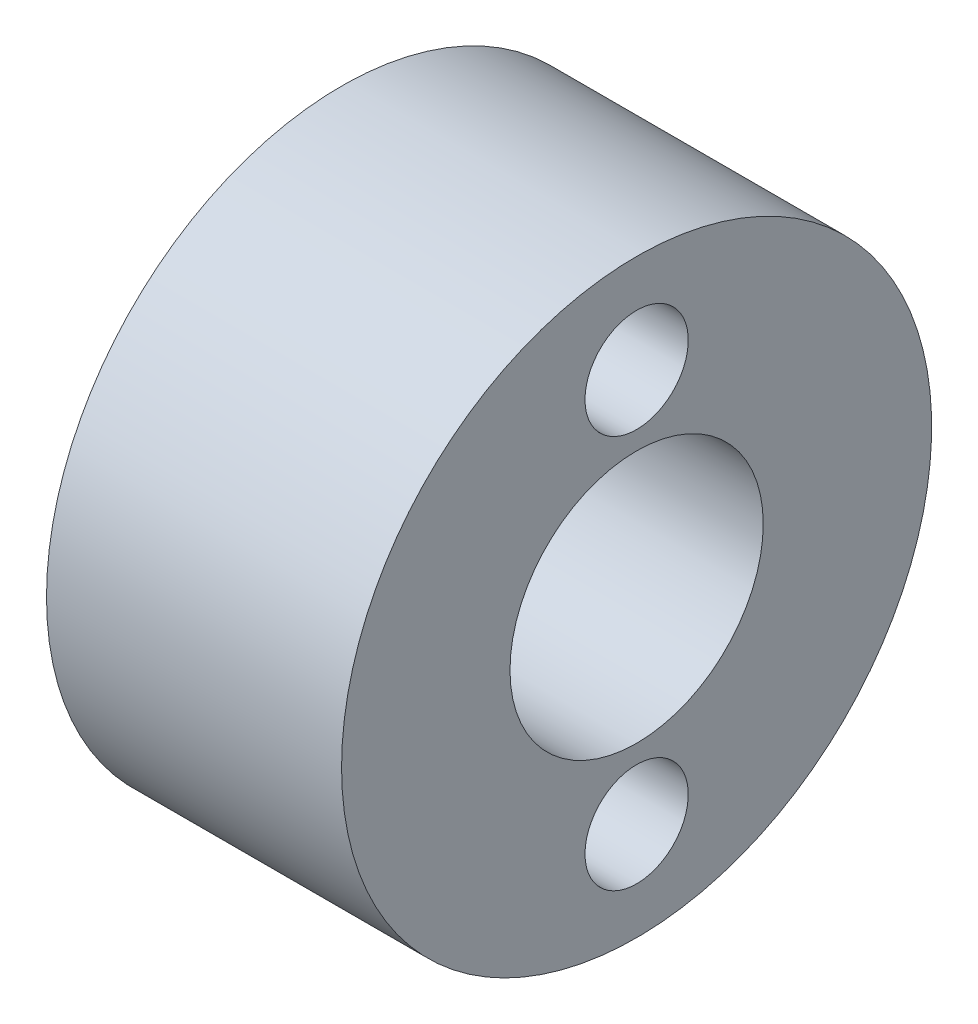
ISO-10303-21;
HEADER;
FILE_DESCRIPTION(('STEP AP214'),'2;1');
FILE_NAME('part.step','',(''),(''),'','','');
FILE_SCHEMA(('AUTOMOTIVE_DESIGN { 1 0 10303 214 1 1 1 1 }'));
ENDSEC;
DATA;
#1=APPLICATION_CONTEXT('core data for automotive mechanical design processes');
#2=APPLICATION_PROTOCOL_DEFINITION('international standard','automotive_design',2000,#1);
#3=PRODUCT_CONTEXT('',#1,'mechanical');
#4=PRODUCT('Part','Part','',(#3));
#5=PRODUCT_RELATED_PRODUCT_CATEGORY('part','',(#4));
#6=PRODUCT_DEFINITION_FORMATION('','',#4);
#7=PRODUCT_DEFINITION_CONTEXT('part definition',#1,'design');
#8=PRODUCT_DEFINITION('design','',#6,#7);
#9=PRODUCT_DEFINITION_SHAPE('','',#8);
#10=(LENGTH_UNIT() NAMED_UNIT(*) SI_UNIT(.MILLI.,.METRE.));
#11=(NAMED_UNIT(*) PLANE_ANGLE_UNIT() SI_UNIT($,.RADIAN.));
#12=(NAMED_UNIT(*) SI_UNIT($,.STERADIAN.) SOLID_ANGLE_UNIT());
#13=UNCERTAINTY_MEASURE_WITH_UNIT(LENGTH_MEASURE(1.E-05),#10,'distance_accuracy_value','');
#14=(GEOMETRIC_REPRESENTATION_CONTEXT(3) GLOBAL_UNCERTAINTY_ASSIGNED_CONTEXT((#13)) GLOBAL_UNIT_ASSIGNED_CONTEXT((#10,
#11,#12)) REPRESENTATION_CONTEXT('',''));
#15=CARTESIAN_POINT('',(0.,0.,0.));
#16=DIRECTION('',(0.,0.,1.));
#17=DIRECTION('',(1.,0.,0.));
#18=AXIS2_PLACEMENT_3D('',#15,#16,#17);
#19=CARTESIAN_POINT('',(25.,8.,-44.));
#20=DIRECTION('',(1.,0.,0.));
#21=DIRECTION('',(0.,0.,-1.));
#22=AXIS2_PLACEMENT_3D('',#19,#20,#21);
#23=PLANE('',#22);
#24=CARTESIAN_POINT('',(25.,8.,-44.));
#25=DIRECTION('',(-1.,0.,0.));
#26=DIRECTION('',(0.,0.,1.));
#27=AXIS2_PLACEMENT_3D('',#24,#25,#26);
#28=CIRCLE('',#27,2.1);
#29=CARTESIAN_POINT('',(25.,8.,-41.9));
#30=VERTEX_POINT('',#29);
#31=EDGE_CURVE('E16',#30,#30,#28,.F.);
#32=ORIENTED_EDGE('',*,*,#31,.T.);
#33=EDGE_LOOP('',(#32));
#34=FACE_BOUND('',#33,.T.);
#35=ADVANCED_FACE('F13',(#34),#23,.T.);
#36=CARTESIAN_POINT('',(25.,-8.,-44.));
#37=DIRECTION('',(1.,0.,0.));
#38=DIRECTION('',(0.,0.,-1.));
#39=AXIS2_PLACEMENT_3D('',#36,#37,#38);
#40=PLANE('',#39);
#41=CARTESIAN_POINT('',(25.,-8.,-44.));
#42=DIRECTION('',(-1.,0.,0.));
#43=DIRECTION('',(0.,0.,1.));
#44=AXIS2_PLACEMENT_3D('',#41,#42,#43);
#45=CIRCLE('',#44,2.1);
#46=CARTESIAN_POINT('',(25.,-8.,-41.9));
#47=VERTEX_POINT('',#46);
#48=EDGE_CURVE('E38',#47,#47,#45,.F.);
#49=ORIENTED_EDGE('',*,*,#48,.T.);
#50=EDGE_LOOP('',(#49));
#51=FACE_BOUND('',#50,.T.);
#52=ADVANCED_FACE('F49',(#51),#40,.T.);
#53=CARTESIAN_POINT('',(25.,8.,-44.));
#54=DIRECTION('',(-1.,0.,0.));
#55=DIRECTION('',(0.,0.,1.));
#56=AXIS2_PLACEMENT_3D('',#53,#54,#55);
#57=CYLINDRICAL_SURFACE('',#56,2.1);
#58=CARTESIAN_POINT('',(31.,8.,-44.));
#59=DIRECTION('',(-1.,0.,0.));
#60=DIRECTION('',(0.,0.,1.));
#61=AXIS2_PLACEMENT_3D('',#58,#59,#60);
#62=CIRCLE('',#61,2.1);
#63=CARTESIAN_POINT('',(31.,8.,-41.9));
#64=VERTEX_POINT('',#63);
#65=EDGE_CURVE('E33',#64,#64,#62,.T.);
#66=ORIENTED_EDGE('',*,*,#65,.F.);
#67=EDGE_LOOP('',(#66));
#68=FACE_BOUND('',#67,.T.);
#69=ORIENTED_EDGE('',*,*,#31,.F.);
#70=EDGE_LOOP('',(#69));
#71=FACE_BOUND('',#70,.T.);
#72=ADVANCED_FACE('F46',(#68,#71),#57,.F.);
#73=CARTESIAN_POINT('',(18.,0.,-44.));
#74=DIRECTION('',(-1.,0.,0.));
#75=DIRECTION('',(0.,0.,1.));
#76=AXIS2_PLACEMENT_3D('',#73,#74,#75);
#77=CYLINDRICAL_SURFACE('',#76,5.15);
#78=CARTESIAN_POINT('',(31.,0.,-44.));
#79=DIRECTION('',(-1.,0.,0.));
#80=DIRECTION('',(0.,0.,1.));
#81=AXIS2_PLACEMENT_3D('',#78,#79,#80);
#82=CIRCLE('',#81,5.15);
#83=CARTESIAN_POINT('',(31.,0.,-38.85));
#84=VERTEX_POINT('',#83);
#85=EDGE_CURVE('E30',#84,#84,#82,.T.);
#86=ORIENTED_EDGE('',*,*,#85,.F.);
#87=EDGE_LOOP('',(#86));
#88=FACE_BOUND('',#87,.T.);
#89=CARTESIAN_POINT('',(19.,0.,-44.));
#90=DIRECTION('',(-1.,0.,0.));
#91=DIRECTION('',(0.,0.,1.));
#92=AXIS2_PLACEMENT_3D('',#89,#90,#91);
#93=CIRCLE('',#92,5.15);
#94=CARTESIAN_POINT('',(19.,0.,-38.85));
#95=VERTEX_POINT('',#94);
#96=EDGE_CURVE('E36',#95,#95,#93,.T.);
#97=ORIENTED_EDGE('',*,*,#96,.T.);
#98=EDGE_LOOP('',(#97));
#99=FACE_BOUND('',#98,.T.);
#100=ADVANCED_FACE('F48',(#88,#99),#77,.F.);
#101=CARTESIAN_POINT('',(25.,-8.,-44.));
#102=DIRECTION('',(-1.,0.,0.));
#103=DIRECTION('',(0.,0.,1.));
#104=AXIS2_PLACEMENT_3D('',#101,#102,#103);
#105=CYLINDRICAL_SURFACE('',#104,2.1);
#106=CARTESIAN_POINT('',(31.,-8.,-44.));
#107=DIRECTION('',(-1.,0.,0.));
#108=DIRECTION('',(0.,0.,1.));
#109=AXIS2_PLACEMENT_3D('',#106,#107,#108);
#110=CIRCLE('',#109,2.1);
#111=CARTESIAN_POINT('',(31.,-8.,-41.9));
#112=VERTEX_POINT('',#111);
#113=EDGE_CURVE('E25',#112,#112,#110,.T.);
#114=ORIENTED_EDGE('',*,*,#113,.F.);
#115=EDGE_LOOP('',(#114));
#116=FACE_BOUND('',#115,.T.);
#117=ORIENTED_EDGE('',*,*,#48,.F.);
#118=EDGE_LOOP('',(#117));
#119=FACE_BOUND('',#118,.T.);
#120=ADVANCED_FACE('F57',(#116,#119),#105,.F.);
#121=CARTESIAN_POINT('',(19.,0.,-44.));
#122=DIRECTION('',(1.,0.,0.));
#123=DIRECTION('',(0.,0.,-1.));
#124=AXIS2_PLACEMENT_3D('',#121,#122,#123);
#125=PLANE('',#124);
#126=ORIENTED_EDGE('',*,*,#96,.F.);
#127=EDGE_LOOP('',(#126));
#128=FACE_BOUND('',#127,.T.);
#129=CARTESIAN_POINT('',(19.,0.,-44.));
#130=DIRECTION('',(-1.,0.,0.));
#131=DIRECTION('',(0.,0.,1.));
#132=AXIS2_PLACEMENT_3D('',#129,#130,#131);
#133=CIRCLE('',#132,12.);
#134=CARTESIAN_POINT('',(19.,0.,-32.));
#135=VERTEX_POINT('',#134);
#136=EDGE_CURVE('E20',#135,#135,#133,.F.);
#137=ORIENTED_EDGE('',*,*,#136,.F.);
#138=EDGE_LOOP('',(#137));
#139=FACE_BOUND('',#138,.T.);
#140=ADVANCED_FACE('F68',(#128,#139),#125,.F.);
#141=CARTESIAN_POINT('',(31.,0.,-44.));
#142=DIRECTION('',(1.,0.,0.));
#143=DIRECTION('',(0.,0.,-1.));
#144=AXIS2_PLACEMENT_3D('',#141,#142,#143);
#145=PLANE('',#144);
#146=ORIENTED_EDGE('',*,*,#113,.T.);
#147=EDGE_LOOP('',(#146));
#148=FACE_BOUND('',#147,.T.);
#149=ORIENTED_EDGE('',*,*,#85,.T.);
#150=EDGE_LOOP('',(#149));
#151=FACE_BOUND('',#150,.T.);
#152=ORIENTED_EDGE('',*,*,#65,.T.);
#153=EDGE_LOOP('',(#152));
#154=FACE_BOUND('',#153,.T.);
#155=CARTESIAN_POINT('',(31.,0.,-44.));
#156=DIRECTION('',(-1.,0.,0.));
#157=DIRECTION('',(0.,0.,1.));
#158=AXIS2_PLACEMENT_3D('',#155,#156,#157);
#159=CIRCLE('',#158,12.);
#160=CARTESIAN_POINT('',(31.,0.,-32.));
#161=VERTEX_POINT('',#160);
#162=EDGE_CURVE('E8',#161,#161,#159,.T.);
#163=ORIENTED_EDGE('',*,*,#162,.F.);
#164=EDGE_LOOP('',(#163));
#165=FACE_BOUND('',#164,.T.);
#166=ADVANCED_FACE('F63',(#148,#151,#154,#165),#145,.T.);
#167=CARTESIAN_POINT('',(19.,0.,-44.));
#168=DIRECTION('',(-1.,0.,0.));
#169=DIRECTION('',(0.,0.,1.));
#170=AXIS2_PLACEMENT_3D('',#167,#168,#169);
#171=CYLINDRICAL_SURFACE('',#170,12.);
#172=ORIENTED_EDGE('',*,*,#162,.T.);
#173=EDGE_LOOP('',(#172));
#174=FACE_BOUND('',#173,.T.);
#175=ORIENTED_EDGE('',*,*,#136,.T.);
#176=EDGE_LOOP('',(#175));
#177=FACE_BOUND('',#176,.T.);
#178=ADVANCED_FACE('F61',(#174,#177),#171,.T.);
#179=CLOSED_SHELL('',(#35,#52,#72,#100,#120,#140,#166,#178));
#180=MANIFOLD_SOLID_BREP('B1',#179);
#181=ADVANCED_BREP_SHAPE_REPRESENTATION('',(#18,#180),#14);
#182=SHAPE_DEFINITION_REPRESENTATION(#9,#181);
ENDSEC;
END-ISO-10303-21;
